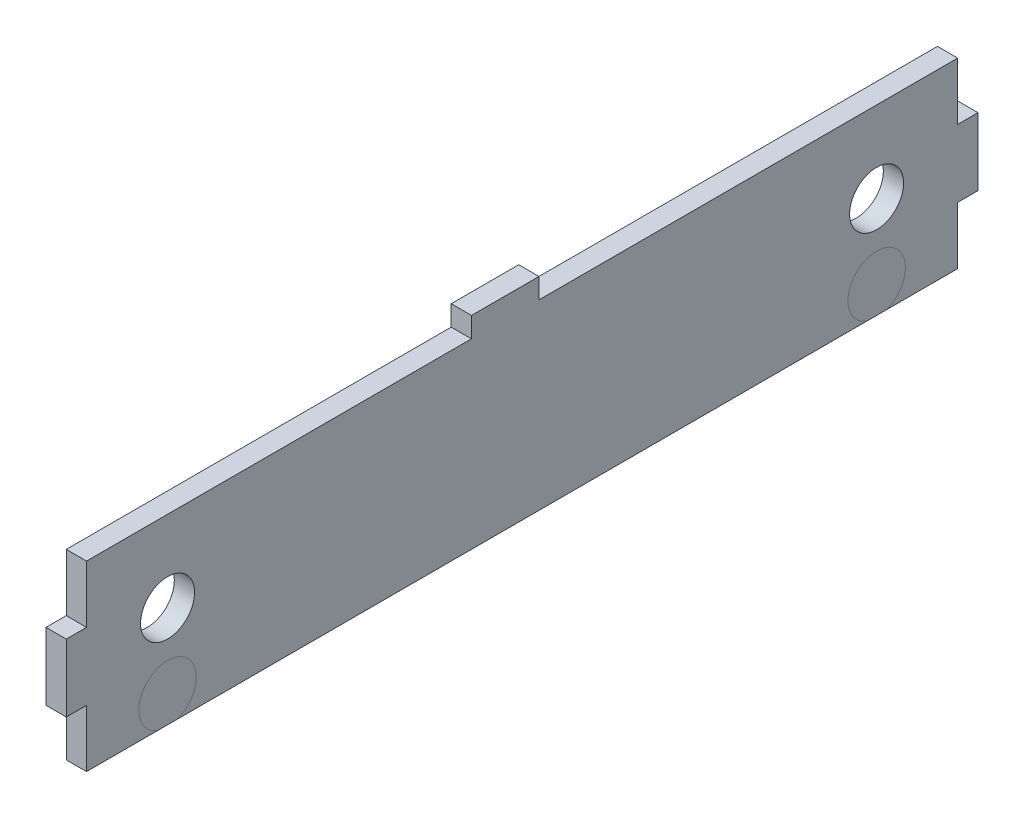
ISO-10303-21;
HEADER;
FILE_DESCRIPTION(('STEP AP214'),'2;1');
FILE_NAME('part.step','',(''),(''),'','','');
FILE_SCHEMA(('AUTOMOTIVE_DESIGN { 1 0 10303 214 1 1 1 1 }'));
ENDSEC;
DATA;
#1=APPLICATION_CONTEXT('core data for automotive mechanical design processes');
#2=APPLICATION_PROTOCOL_DEFINITION('international standard','automotive_design',2000,#1);
#3=PRODUCT_CONTEXT('',#1,'mechanical');
#4=PRODUCT('Part','Part','',(#3));
#5=PRODUCT_RELATED_PRODUCT_CATEGORY('part','',(#4));
#6=PRODUCT_DEFINITION_FORMATION('','',#4);
#7=PRODUCT_DEFINITION_CONTEXT('part definition',#1,'design');
#8=PRODUCT_DEFINITION('design','',#6,#7);
#9=PRODUCT_DEFINITION_SHAPE('','',#8);
#10=(LENGTH_UNIT() NAMED_UNIT(*) SI_UNIT(.MILLI.,.METRE.));
#11=(NAMED_UNIT(*) PLANE_ANGLE_UNIT() SI_UNIT($,.RADIAN.));
#12=(NAMED_UNIT(*) SI_UNIT($,.STERADIAN.) SOLID_ANGLE_UNIT());
#13=UNCERTAINTY_MEASURE_WITH_UNIT(LENGTH_MEASURE(1.E-05),#10,'distance_accuracy_value','');
#14=(GEOMETRIC_REPRESENTATION_CONTEXT(3) GLOBAL_UNCERTAINTY_ASSIGNED_CONTEXT((#13)) GLOBAL_UNIT_ASSIGNED_CONTEXT((#10,
#11,#12)) REPRESENTATION_CONTEXT('',''));
#15=CARTESIAN_POINT('',(0.,0.,0.));
#16=DIRECTION('',(0.,0.,1.));
#17=DIRECTION('',(1.,0.,0.));
#18=AXIS2_PLACEMENT_3D('',#15,#16,#17);
#19=CARTESIAN_POINT('',(-313.51,39.5000001110803,221.989999999999));
#20=CARTESIAN_POINT('',(-313.51,39.5000001110803,225.009999999999));
#21=CARTESIAN_POINT('',(-310.49,39.5000001110803,221.989999999999));
#22=CARTESIAN_POINT('',(-310.49,39.5000001110803,225.009999999999));
#23=(BOUNDED_SURFACE() B_SPLINE_SURFACE(1,1,((#19,#20),(#21,#22)),.UNSPECIFIED.,.F.,.F.,
.F.) B_SPLINE_SURFACE_WITH_KNOTS((2,2),(2,2),(-0.001,0.301),(-0.001,0.301),
.UNSPECIFIED.) GEOMETRIC_REPRESENTATION_ITEM() RATIONAL_B_SPLINE_SURFACE(((1.,1.),(1.,1.))) REPRESENTATION_ITEM('') SURFACE());
#24=CARTESIAN_POINT('',(-310.5,39.5000001110803,221.999999999999));
#25=CARTESIAN_POINT('',(-313.5,39.5000001110803,221.999999999999));
#26=(BOUNDED_CURVE() B_SPLINE_CURVE(1,(#24,#25),.UNSPECIFIED.,.F.,
.F.) B_SPLINE_CURVE_WITH_KNOTS((2,2),(-0.15,0.15),
.UNSPECIFIED.) CURVE() GEOMETRIC_REPRESENTATION_ITEM() RATIONAL_B_SPLINE_CURVE((1.,1.)) REPRESENTATION_ITEM(''));
#27=CARTESIAN_POINT('',(-310.5,39.5000001110803,221.999999999999));
#28=VERTEX_POINT('',#27);
#29=CARTESIAN_POINT('',(-313.5,39.5000001110803,221.999999999999));
#30=VERTEX_POINT('',#29);
#31=EDGE_CURVE('E68',#28,#30,#26,.T.);
#32=CARTESIAN_POINT('',(-310.5,39.5000001110803,221.999999999999));
#33=CARTESIAN_POINT('',(-310.5,39.5000001110803,224.999999999999));
#34=(BOUNDED_CURVE() B_SPLINE_CURVE(1,(#32,#33),.UNSPECIFIED.,.F.,
.F.) B_SPLINE_CURVE_WITH_KNOTS((2,2),(0.,0.3),
.UNSPECIFIED.) CURVE() GEOMETRIC_REPRESENTATION_ITEM() RATIONAL_B_SPLINE_CURVE((1.,1.)) REPRESENTATION_ITEM(''));
#35=CARTESIAN_POINT('',(-310.5,39.5000001110803,224.999999999999));
#36=VERTEX_POINT('',#35);
#37=EDGE_CURVE('E53',#28,#36,#34,.T.);
#38=CARTESIAN_POINT('',(-313.5,39.5000001110803,224.999999999999));
#39=CARTESIAN_POINT('',(-310.5,39.5000001110803,224.999999999999));
#40=(BOUNDED_CURVE() B_SPLINE_CURVE(1,(#38,#39),.UNSPECIFIED.,.F.,
.F.) B_SPLINE_CURVE_WITH_KNOTS((2,2),(-0.3,0.),
.UNSPECIFIED.) CURVE() GEOMETRIC_REPRESENTATION_ITEM() RATIONAL_B_SPLINE_CURVE((1.,1.)) REPRESENTATION_ITEM(''));
#41=CARTESIAN_POINT('',(-313.5,39.5000001110803,224.999999999999));
#42=VERTEX_POINT('',#41);
#43=EDGE_CURVE('E340',#42,#36,#40,.T.);
#44=CARTESIAN_POINT('',(-313.5,39.5000001110803,221.999999999999));
#45=CARTESIAN_POINT('',(-313.5,39.5000001110803,224.999999999999));
#46=(BOUNDED_CURVE() B_SPLINE_CURVE(1,(#44,#45),.UNSPECIFIED.,.F.,
.F.) B_SPLINE_CURVE_WITH_KNOTS((2,2),(0.,0.3),
.UNSPECIFIED.) CURVE() GEOMETRIC_REPRESENTATION_ITEM() RATIONAL_B_SPLINE_CURVE((1.,1.)) REPRESENTATION_ITEM(''));
#47=EDGE_CURVE('E227',#30,#42,#46,.T.);
#48=ORIENTED_EDGE('',*,*,#31,.F.);
#49=ORIENTED_EDGE('',*,*,#37,.T.);
#50=ORIENTED_EDGE('',*,*,#43,.F.);
#51=ORIENTED_EDGE('',*,*,#47,.F.);
#52=EDGE_LOOP('',(#48,#49,#50,#51));
#53=FACE_BOUND('',#52,.T.);
#54=ADVANCED_FACE('F42',(#53),#23,.T.);
#55=CARTESIAN_POINT('',(-310.49,49.5000001110803,221.989999999999));
#56=CARTESIAN_POINT('',(-310.49,49.5000001110803,225.009999999999));
#57=CARTESIAN_POINT('',(-313.51,49.5000001110803,221.989999999999));
#58=CARTESIAN_POINT('',(-313.51,49.5000001110803,225.009999999999));
#59=(BOUNDED_SURFACE() B_SPLINE_SURFACE(1,1,((#55,#56),(#57,#58)),.UNSPECIFIED.,.F.,.F.,
.F.) B_SPLINE_SURFACE_WITH_KNOTS((2,2),(2,2),(-0.001,0.301),(-0.001,0.301),
.UNSPECIFIED.) GEOMETRIC_REPRESENTATION_ITEM() RATIONAL_B_SPLINE_SURFACE(((1.,1.),(1.,1.))) REPRESENTATION_ITEM('') SURFACE());
#60=CARTESIAN_POINT('',(-313.5,49.5000001110803,221.999999999999));
#61=CARTESIAN_POINT('',(-310.5,49.5000001110803,221.999999999999));
#62=(BOUNDED_CURVE() B_SPLINE_CURVE(1,(#60,#61),.UNSPECIFIED.,.F.,
.F.) B_SPLINE_CURVE_WITH_KNOTS((2,2),(-0.3,0.),
.UNSPECIFIED.) CURVE() GEOMETRIC_REPRESENTATION_ITEM() RATIONAL_B_SPLINE_CURVE((1.,1.)) REPRESENTATION_ITEM(''));
#63=CARTESIAN_POINT('',(-313.5,49.5000001110803,221.999999999999));
#64=VERTEX_POINT('',#63);
#65=CARTESIAN_POINT('',(-310.5,49.5000001110803,221.999999999999));
#66=VERTEX_POINT('',#65);
#67=EDGE_CURVE('E341',#64,#66,#62,.T.);
#68=CARTESIAN_POINT('',(-313.5,49.5000001110803,221.999999999999));
#69=CARTESIAN_POINT('',(-313.5,49.5000001110803,224.999999999999));
#70=(BOUNDED_CURVE() B_SPLINE_CURVE(1,(#68,#69),.UNSPECIFIED.,.F.,
.F.) B_SPLINE_CURVE_WITH_KNOTS((2,2),(0.,0.3),
.UNSPECIFIED.) CURVE() GEOMETRIC_REPRESENTATION_ITEM() RATIONAL_B_SPLINE_CURVE((1.,1.)) REPRESENTATION_ITEM(''));
#71=CARTESIAN_POINT('',(-313.5,49.5000001110803,224.999999999999));
#72=VERTEX_POINT('',#71);
#73=EDGE_CURVE('E349',#64,#72,#70,.T.);
#74=CARTESIAN_POINT('',(-310.5,49.5000001110803,224.999999999999));
#75=CARTESIAN_POINT('',(-313.5,49.5000001110803,224.999999999999));
#76=(BOUNDED_CURVE() B_SPLINE_CURVE(1,(#74,#75),.UNSPECIFIED.,.F.,
.F.) B_SPLINE_CURVE_WITH_KNOTS((2,2),(0.,0.3),
.UNSPECIFIED.) CURVE() GEOMETRIC_REPRESENTATION_ITEM() RATIONAL_B_SPLINE_CURVE((1.,1.)) REPRESENTATION_ITEM(''));
#77=CARTESIAN_POINT('',(-310.5,49.5000001110803,224.999999999999));
#78=VERTEX_POINT('',#77);
#79=EDGE_CURVE('E94',#78,#72,#76,.T.);
#80=CARTESIAN_POINT('',(-310.5,49.5000001110803,221.999999999999));
#81=CARTESIAN_POINT('',(-310.5,49.5000001110803,224.999999999999));
#82=(BOUNDED_CURVE() B_SPLINE_CURVE(1,(#80,#81),.UNSPECIFIED.,.F.,
.F.) B_SPLINE_CURVE_WITH_KNOTS((2,2),(0.,0.3),
.UNSPECIFIED.) CURVE() GEOMETRIC_REPRESENTATION_ITEM() RATIONAL_B_SPLINE_CURVE((1.,1.)) REPRESENTATION_ITEM(''));
#83=EDGE_CURVE('E86',#66,#78,#82,.T.);
#84=ORIENTED_EDGE('',*,*,#67,.F.);
#85=ORIENTED_EDGE('',*,*,#73,.T.);
#86=ORIENTED_EDGE('',*,*,#79,.F.);
#87=ORIENTED_EDGE('',*,*,#83,.F.);
#88=EDGE_LOOP('',(#84,#85,#86,#87));
#89=FACE_BOUND('',#88,.T.);
#90=ADVANCED_FACE('F627',(#89),#59,.T.);
#91=CARTESIAN_POINT('',(-313.51,49.5100001110803,224.999999999999));
#92=CARTESIAN_POINT('',(-310.49,49.5100001110803,224.999999999999));
#93=CARTESIAN_POINT('',(-313.51,39.4900001110803,224.999999999999));
#94=CARTESIAN_POINT('',(-310.49,39.4900001110803,224.999999999999));
#95=(BOUNDED_SURFACE() B_SPLINE_SURFACE(1,1,((#91,#92),(#93,#94)),.UNSPECIFIED.,.F.,.F.,
.F.) B_SPLINE_SURFACE_WITH_KNOTS((2,2),(2,2),(-0.501,0.501),(-0.151,0.151),
.UNSPECIFIED.) GEOMETRIC_REPRESENTATION_ITEM() RATIONAL_B_SPLINE_SURFACE(((1.,1.),(1.,1.))) REPRESENTATION_ITEM('') SURFACE());
#96=CARTESIAN_POINT('',(-310.5,39.5000001110803,224.999999999999));
#97=CARTESIAN_POINT('',(-310.5,49.5000001110803,224.999999999999));
#98=(BOUNDED_CURVE() B_SPLINE_CURVE(1,(#96,#97),.UNSPECIFIED.,.F.,
.F.) B_SPLINE_CURVE_WITH_KNOTS((2,2),(0.850000011108212,1.85000001110821),
.UNSPECIFIED.) CURVE() GEOMETRIC_REPRESENTATION_ITEM() RATIONAL_B_SPLINE_CURVE((1.,1.)) REPRESENTATION_ITEM(''));
#99=EDGE_CURVE('E483',#36,#78,#98,.T.);
#100=CARTESIAN_POINT('',(-313.5,49.5000001110803,224.999999999999));
#101=CARTESIAN_POINT('',(-313.5,39.5000001110803,224.999999999999));
#102=(BOUNDED_CURVE() B_SPLINE_CURVE(1,(#100,#101),.UNSPECIFIED.,.F.,
.F.) B_SPLINE_CURVE_WITH_KNOTS((2,2),(0.850000011108212,1.85000001110821),
.UNSPECIFIED.) CURVE() GEOMETRIC_REPRESENTATION_ITEM() RATIONAL_B_SPLINE_CURVE((1.,1.)) REPRESENTATION_ITEM(''));
#103=EDGE_CURVE('E350',#72,#42,#102,.T.);
#104=ORIENTED_EDGE('',*,*,#99,.T.);
#105=ORIENTED_EDGE('',*,*,#79,.T.);
#106=ORIENTED_EDGE('',*,*,#103,.T.);
#107=ORIENTED_EDGE('',*,*,#43,.T.);
#108=EDGE_LOOP('',(#104,#105,#106,#107));
#109=FACE_BOUND('',#108,.T.);
#110=ADVANCED_FACE('F601',(#109),#95,.T.);
#111=CARTESIAN_POINT('',(-310.49,19.9899961853027,221.999999999999));
#112=CARTESIAN_POINT('',(-313.51,19.9899961853027,221.999999999999));
#113=CARTESIAN_POINT('',(-310.49,39.5100001110803,221.999999999999));
#114=CARTESIAN_POINT('',(-313.51,39.5100001110803,221.999999999999));
#115=(BOUNDED_SURFACE() B_SPLINE_SURFACE(1,1,((#111,#112),(#113,#114)),.UNSPECIFIED.,.F.,.F.,
.F.) B_SPLINE_SURFACE_WITH_KNOTS((2,2),(2,2),(-1.10100038146954,0.851000011108213),(-0.001,
0.301),.UNSPECIFIED.) GEOMETRIC_REPRESENTATION_ITEM() RATIONAL_B_SPLINE_SURFACE(((1.,1.),(1.,1.))) REPRESENTATION_ITEM('') SURFACE());
#116=DIRECTION('',(-1.,0.,0.));
#117=VECTOR('',#116,1.);
#118=CARTESIAN_POINT('',(-312.,30.9999961853027,221.999999999999));
#119=LINE('',#118,#117);
#120=CARTESIAN_POINT('',(-310.5,30.9999961853027,221.999999999999));
#121=VERTEX_POINT('',#120);
#122=CARTESIAN_POINT('',(-313.5,30.9999961853027,221.999999999999));
#123=VERTEX_POINT('',#122);
#124=EDGE_CURVE('E199',#121,#123,#119,.T.);
#125=CARTESIAN_POINT('',(-310.5,39.5000001110803,221.999999999999));
#126=CARTESIAN_POINT('',(-310.5,19.9999961853027,221.999999999999));
#127=(BOUNDED_CURVE() B_SPLINE_CURVE(1,(#125,#126),.UNSPECIFIED.,.F.,
.F.) B_SPLINE_CURVE_WITH_KNOTS((2,2),(4.39999998889179,6.35000038146954),
.UNSPECIFIED.) CURVE() GEOMETRIC_REPRESENTATION_ITEM() RATIONAL_B_SPLINE_CURVE((1.,1.)) REPRESENTATION_ITEM(''));
#128=EDGE_CURVE('E404',#28,#121,#127,.T.);
#129=CARTESIAN_POINT('',(-313.5,19.9999961853027,221.999999999999));
#130=CARTESIAN_POINT('',(-313.5,39.5000001110803,221.999999999999));
#131=(BOUNDED_CURVE() B_SPLINE_CURVE(1,(#129,#130),.UNSPECIFIED.,.F.,
.F.) B_SPLINE_CURVE_WITH_KNOTS((2,2),(-6.35000038146954,-4.39999998889179),
.UNSPECIFIED.) CURVE() GEOMETRIC_REPRESENTATION_ITEM() RATIONAL_B_SPLINE_CURVE((1.,1.)) REPRESENTATION_ITEM(''));
#132=EDGE_CURVE('E216',#123,#30,#131,.T.);
#133=ORIENTED_EDGE('',*,*,#124,.F.);
#134=ORIENTED_EDGE('',*,*,#128,.F.);
#135=ORIENTED_EDGE('',*,*,#31,.T.);
#136=ORIENTED_EDGE('',*,*,#132,.F.);
#137=EDGE_LOOP('',(#133,#134,#135,#136));
#138=FACE_BOUND('',#137,.T.);
#139=ADVANCED_FACE('F224',(#138),#115,.T.);
#140=CARTESIAN_POINT('',(-310.49,49.4900001110803,221.999999999999));
#141=CARTESIAN_POINT('',(-313.51,49.4900001110803,221.999999999999));
#142=CARTESIAN_POINT('',(-310.49,58.0100002221624,221.999999999999));
#143=CARTESIAN_POINT('',(-313.51,58.0100002221624,221.999999999999));
#144=(BOUNDED_SURFACE() B_SPLINE_SURFACE(1,1,((#140,#141),(#142,#143)),.UNSPECIFIED.,.F.,.F.,
.F.) B_SPLINE_SURFACE_WITH_KNOTS((2,2),(2,2),(1.84900001110821,2.70100002221642),(-0.001,0.301),
.UNSPECIFIED.) GEOMETRIC_REPRESENTATION_ITEM() RATIONAL_B_SPLINE_SURFACE(((1.,1.),(1.,1.))) REPRESENTATION_ITEM('') SURFACE());
#145=CARTESIAN_POINT('',(-310.5,58.0000002221624,221.999999999999));
#146=CARTESIAN_POINT('',(-310.5,49.5000001110803,221.999999999999));
#147=(BOUNDED_CURVE() B_SPLINE_CURVE(1,(#145,#146),.UNSPECIFIED.,.F.,
.F.) B_SPLINE_CURVE_WITH_KNOTS((2,2),(2.54999997778358,3.39999998889179),
.UNSPECIFIED.) CURVE() GEOMETRIC_REPRESENTATION_ITEM() RATIONAL_B_SPLINE_CURVE((1.,1.)) REPRESENTATION_ITEM(''));
#148=CARTESIAN_POINT('',(-310.5,58.0000002221624,221.999999999999));
#149=VERTEX_POINT('',#148);
#150=EDGE_CURVE('E460',#149,#66,#147,.T.);
#151=CARTESIAN_POINT('',(-310.5,58.0000002221624,221.999999999999));
#152=CARTESIAN_POINT('',(-313.5,58.0000002221624,221.999999999999));
#153=(BOUNDED_CURVE() B_SPLINE_CURVE(1,(#151,#152),.UNSPECIFIED.,.F.,
.F.) B_SPLINE_CURVE_WITH_KNOTS((2,2),(0.,0.3),
.UNSPECIFIED.) CURVE() GEOMETRIC_REPRESENTATION_ITEM() RATIONAL_B_SPLINE_CURVE((1.,1.)) REPRESENTATION_ITEM(''));
#154=CARTESIAN_POINT('',(-313.5,58.0000002221624,221.999999999999));
#155=VERTEX_POINT('',#154);
#156=EDGE_CURVE('E277',#149,#155,#153,.T.);
#157=CARTESIAN_POINT('',(-313.5,49.5000001110803,221.999999999999));
#158=CARTESIAN_POINT('',(-313.5,58.0000002221624,221.999999999999));
#159=(BOUNDED_CURVE() B_SPLINE_CURVE(1,(#157,#158),.UNSPECIFIED.,.F.,
.F.) B_SPLINE_CURVE_WITH_KNOTS((2,2),(-3.39999998889179,-2.54999997778358),
.UNSPECIFIED.) CURVE() GEOMETRIC_REPRESENTATION_ITEM() RATIONAL_B_SPLINE_CURVE((1.,1.)) REPRESENTATION_ITEM(''));
#160=EDGE_CURVE('E237',#64,#155,#159,.T.);
#161=ORIENTED_EDGE('',*,*,#67,.T.);
#162=ORIENTED_EDGE('',*,*,#150,.F.);
#163=ORIENTED_EDGE('',*,*,#156,.T.);
#164=ORIENTED_EDGE('',*,*,#160,.F.);
#165=EDGE_LOOP('',(#161,#162,#163,#164));
#166=FACE_BOUND('',#165,.T.);
#167=ADVANCED_FACE('F873',(#166),#144,.T.);
#168=CARTESIAN_POINT('',(-313.51,49.5000001110803,93.009999999999));
#169=CARTESIAN_POINT('',(-313.51,49.5000001110803,89.989999999999));
#170=CARTESIAN_POINT('',(-310.49,49.5000001110803,93.009999999999));
#171=CARTESIAN_POINT('',(-310.49,49.5000001110803,89.989999999999));
#172=(BOUNDED_SURFACE() B_SPLINE_SURFACE(1,1,((#168,#169),(#170,#171)),.UNSPECIFIED.,.F.,.F.,
.F.) B_SPLINE_SURFACE_WITH_KNOTS((2,2),(2,2),(-0.001,0.301000000000004),(0.499,0.801),
.UNSPECIFIED.) GEOMETRIC_REPRESENTATION_ITEM() RATIONAL_B_SPLINE_SURFACE(((1.,1.),(1.,1.))) REPRESENTATION_ITEM('') SURFACE());
#173=CARTESIAN_POINT('',(-310.5,49.5000001110803,92.999999999999));
#174=CARTESIAN_POINT('',(-313.5,49.5000001110803,92.999999999999));
#175=(BOUNDED_CURVE() B_SPLINE_CURVE(1,(#173,#174),.UNSPECIFIED.,.F.,
.F.) B_SPLINE_CURVE_WITH_KNOTS((2,2),(-0.15,0.15),
.UNSPECIFIED.) CURVE() GEOMETRIC_REPRESENTATION_ITEM() RATIONAL_B_SPLINE_CURVE((1.,1.)) REPRESENTATION_ITEM(''));
#176=CARTESIAN_POINT('',(-310.5,49.5000001110803,92.999999999999));
#177=VERTEX_POINT('',#176);
#178=CARTESIAN_POINT('',(-313.5,49.5000001110803,92.999999999999));
#179=VERTEX_POINT('',#178);
#180=EDGE_CURVE('E500',#177,#179,#175,.T.);
#181=CARTESIAN_POINT('',(-310.5,49.5000001110803,92.999999999999));
#182=CARTESIAN_POINT('',(-310.5,49.5000001110803,89.999999999999));
#183=(BOUNDED_CURVE() B_SPLINE_CURVE(1,(#181,#182),.UNSPECIFIED.,.F.,
.F.) B_SPLINE_CURVE_WITH_KNOTS((2,2),(0.5,0.8),
.UNSPECIFIED.) CURVE() GEOMETRIC_REPRESENTATION_ITEM() RATIONAL_B_SPLINE_CURVE((1.,1.)) REPRESENTATION_ITEM(''));
#184=CARTESIAN_POINT('',(-310.5,49.5000001110803,89.999999999999));
#185=VERTEX_POINT('',#184);
#186=EDGE_CURVE('E268',#177,#185,#183,.T.);
#187=CARTESIAN_POINT('',(-313.5,49.5000001110803,89.999999999999));
#188=CARTESIAN_POINT('',(-310.5,49.5000001110803,89.999999999999));
#189=(BOUNDED_CURVE() B_SPLINE_CURVE(1,(#187,#188),.UNSPECIFIED.,.F.,
.F.) B_SPLINE_CURVE_WITH_KNOTS((2,2),(0.,0.3),
.UNSPECIFIED.) CURVE() GEOMETRIC_REPRESENTATION_ITEM() RATIONAL_B_SPLINE_CURVE((1.,1.)) REPRESENTATION_ITEM(''));
#190=CARTESIAN_POINT('',(-313.5,49.5000001110803,89.999999999999));
#191=VERTEX_POINT('',#190);
#192=EDGE_CURVE('E435',#191,#185,#189,.T.);
#193=CARTESIAN_POINT('',(-313.5,49.5000001110803,92.999999999999));
#194=CARTESIAN_POINT('',(-313.5,49.5000001110803,89.999999999999));
#195=(BOUNDED_CURVE() B_SPLINE_CURVE(1,(#193,#194),.UNSPECIFIED.,.F.,
.F.) B_SPLINE_CURVE_WITH_KNOTS((2,2),(0.5,0.8),
.UNSPECIFIED.) CURVE() GEOMETRIC_REPRESENTATION_ITEM() RATIONAL_B_SPLINE_CURVE((1.,1.)) REPRESENTATION_ITEM(''));
#196=EDGE_CURVE('E234',#179,#191,#195,.T.);
#197=ORIENTED_EDGE('',*,*,#180,.F.);
#198=ORIENTED_EDGE('',*,*,#186,.T.);
#199=ORIENTED_EDGE('',*,*,#192,.F.);
#200=ORIENTED_EDGE('',*,*,#196,.F.);
#201=EDGE_LOOP('',(#197,#198,#199,#200));
#202=FACE_BOUND('',#201,.T.);
#203=ADVANCED_FACE('F44',(#202),#172,.T.);
#204=CARTESIAN_POINT('',(-310.49,39.5000001110803,93.009999999999));
#205=CARTESIAN_POINT('',(-310.49,39.5000001110803,89.989999999999));
#206=CARTESIAN_POINT('',(-313.51,39.5000001110803,93.009999999999));
#207=CARTESIAN_POINT('',(-313.51,39.5000001110803,89.989999999999));
#208=(BOUNDED_SURFACE() B_SPLINE_SURFACE(1,1,((#204,#205),(#206,#207)),.UNSPECIFIED.,.F.,.F.,
.F.) B_SPLINE_SURFACE_WITH_KNOTS((2,2),(2,2),(-0.00100000000000178,0.301),(-0.001,0.301),
.UNSPECIFIED.) GEOMETRIC_REPRESENTATION_ITEM() RATIONAL_B_SPLINE_SURFACE(((1.,1.),(1.,1.))) REPRESENTATION_ITEM('') SURFACE());
#209=CARTESIAN_POINT('',(-313.5,39.5000001110803,92.999999999999));
#210=CARTESIAN_POINT('',(-310.5,39.5000001110803,92.999999999999));
#211=(BOUNDED_CURVE() B_SPLINE_CURVE(1,(#209,#210),.UNSPECIFIED.,.F.,
.F.) B_SPLINE_CURVE_WITH_KNOTS((2,2),(-0.3,0.),
.UNSPECIFIED.) CURVE() GEOMETRIC_REPRESENTATION_ITEM() RATIONAL_B_SPLINE_CURVE((1.,1.)) REPRESENTATION_ITEM(''));
#212=CARTESIAN_POINT('',(-313.5,39.5000001110803,92.999999999999));
#213=VERTEX_POINT('',#212);
#214=CARTESIAN_POINT('',(-310.5,39.5000001110803,92.999999999999));
#215=VERTEX_POINT('',#214);
#216=EDGE_CURVE('E491',#213,#215,#211,.T.);
#217=CARTESIAN_POINT('',(-313.5,39.5000001110803,92.999999999999));
#218=CARTESIAN_POINT('',(-313.5,39.5000001110803,89.999999999999));
#219=(BOUNDED_CURVE() B_SPLINE_CURVE(1,(#217,#218),.UNSPECIFIED.,.F.,
.F.) B_SPLINE_CURVE_WITH_KNOTS((2,2),(0.,0.3),
.UNSPECIFIED.) CURVE() GEOMETRIC_REPRESENTATION_ITEM() RATIONAL_B_SPLINE_CURVE((1.,1.)) REPRESENTATION_ITEM(''));
#220=CARTESIAN_POINT('',(-313.5,39.5000001110803,89.999999999999));
#221=VERTEX_POINT('',#220);
#222=EDGE_CURVE('E278',#213,#221,#219,.T.);
#223=CARTESIAN_POINT('',(-310.5,39.5000001110803,89.999999999999));
#224=CARTESIAN_POINT('',(-313.5,39.5000001110803,89.999999999999));
#225=(BOUNDED_CURVE() B_SPLINE_CURVE(1,(#223,#224),.UNSPECIFIED.,.F.,
.F.) B_SPLINE_CURVE_WITH_KNOTS((2,2),(-0.3,0.),
.UNSPECIFIED.) CURVE() GEOMETRIC_REPRESENTATION_ITEM() RATIONAL_B_SPLINE_CURVE((1.,1.)) REPRESENTATION_ITEM(''));
#226=CARTESIAN_POINT('',(-310.5,39.5000001110803,89.999999999999));
#227=VERTEX_POINT('',#226);
#228=EDGE_CURVE('E289',#227,#221,#225,.T.);
#229=CARTESIAN_POINT('',(-310.5,39.5000001110803,92.999999999999));
#230=CARTESIAN_POINT('',(-310.5,39.5000001110803,89.999999999999));
#231=(BOUNDED_CURVE() B_SPLINE_CURVE(1,(#229,#230),.UNSPECIFIED.,.F.,
.F.) B_SPLINE_CURVE_WITH_KNOTS((2,2),(0.,0.3),
.UNSPECIFIED.) CURVE() GEOMETRIC_REPRESENTATION_ITEM() RATIONAL_B_SPLINE_CURVE((1.,1.)) REPRESENTATION_ITEM(''));
#232=EDGE_CURVE('E243',#215,#227,#231,.T.);
#233=ORIENTED_EDGE('',*,*,#216,.F.);
#234=ORIENTED_EDGE('',*,*,#222,.T.);
#235=ORIENTED_EDGE('',*,*,#228,.F.);
#236=ORIENTED_EDGE('',*,*,#232,.F.);
#237=EDGE_LOOP('',(#233,#234,#235,#236));
#238=FACE_BOUND('',#237,.T.);
#239=ADVANCED_FACE('F814',(#238),#208,.T.);
#240=CARTESIAN_POINT('',(-313.51,39.4900001110803,89.999999999999));
#241=CARTESIAN_POINT('',(-310.49,39.4900001110803,89.999999999999));
#242=CARTESIAN_POINT('',(-313.51,49.5100001110803,89.999999999999));
#243=CARTESIAN_POINT('',(-310.49,49.5100001110803,89.999999999999));
#244=(BOUNDED_SURFACE() B_SPLINE_SURFACE(1,1,((#240,#241),(#242,#243)),.UNSPECIFIED.,.F.,.F.,
.F.) B_SPLINE_SURFACE_WITH_KNOTS((2,2),(2,2),(-0.501,0.501),(-0.151,0.151),
.UNSPECIFIED.) GEOMETRIC_REPRESENTATION_ITEM() RATIONAL_B_SPLINE_SURFACE(((1.,1.),(1.,1.))) REPRESENTATION_ITEM('') SURFACE());
#245=CARTESIAN_POINT('',(-313.5,39.5000001110803,89.999999999999));
#246=CARTESIAN_POINT('',(-313.5,49.5000001110803,89.999999999999));
#247=(BOUNDED_CURVE() B_SPLINE_CURVE(1,(#245,#246),.UNSPECIFIED.,.F.,
.F.) B_SPLINE_CURVE_WITH_KNOTS((2,2),(0.850000011108214,1.85000001110821),
.UNSPECIFIED.) CURVE() GEOMETRIC_REPRESENTATION_ITEM() RATIONAL_B_SPLINE_CURVE((1.,1.)) REPRESENTATION_ITEM(''));
#248=EDGE_CURVE('E296',#221,#191,#247,.T.);
#249=CARTESIAN_POINT('',(-310.5,49.5000001110803,89.999999999999));
#250=CARTESIAN_POINT('',(-310.5,39.5000001110803,89.999999999999));
#251=(BOUNDED_CURVE() B_SPLINE_CURVE(1,(#249,#250),.UNSPECIFIED.,.F.,
.F.) B_SPLINE_CURVE_WITH_KNOTS((2,2),(0.85000001110821,1.85000001110821),
.UNSPECIFIED.) CURVE() GEOMETRIC_REPRESENTATION_ITEM() RATIONAL_B_SPLINE_CURVE((1.,1.)) REPRESENTATION_ITEM(''));
#252=EDGE_CURVE('E442',#185,#227,#251,.T.);
#253=ORIENTED_EDGE('',*,*,#228,.T.);
#254=ORIENTED_EDGE('',*,*,#248,.T.);
#255=ORIENTED_EDGE('',*,*,#192,.T.);
#256=ORIENTED_EDGE('',*,*,#252,.T.);
#257=EDGE_LOOP('',(#253,#254,#255,#256));
#258=FACE_BOUND('',#257,.T.);
#259=ADVANCED_FACE('F809',(#258),#244,.T.);
#260=CARTESIAN_POINT('',(-310.49,58.0100002221624,92.999999999999));
#261=CARTESIAN_POINT('',(-313.51,58.0100002221624,92.999999999999));
#262=CARTESIAN_POINT('',(-310.49,49.4900001110803,92.999999999999));
#263=CARTESIAN_POINT('',(-313.51,49.4900001110803,92.999999999999));
#264=(BOUNDED_SURFACE() B_SPLINE_SURFACE(1,1,((#260,#261),(#262,#263)),.UNSPECIFIED.,.F.,.F.,
.F.) B_SPLINE_SURFACE_WITH_KNOTS((2,2),(2,2),(-0.0152817318439183,0.836718279264296),
(-0.00100000000000178,0.301),
.UNSPECIFIED.) GEOMETRIC_REPRESENTATION_ITEM() RATIONAL_B_SPLINE_SURFACE(((1.,1.),(1.,1.))) REPRESENTATION_ITEM('') SURFACE());
#265=CARTESIAN_POINT('',(-313.5,58.0000002221624,92.999999999999));
#266=CARTESIAN_POINT('',(-313.5,49.5000001110803,92.999999999999));
#267=(BOUNDED_CURVE() B_SPLINE_CURVE(1,(#265,#266),.UNSPECIFIED.,.F.,
.F.) B_SPLINE_CURVE_WITH_KNOTS((2,2),(3.89285912296983,4.74285913407804),
.UNSPECIFIED.) CURVE() GEOMETRIC_REPRESENTATION_ITEM() RATIONAL_B_SPLINE_CURVE((1.,1.)) REPRESENTATION_ITEM(''));
#268=CARTESIAN_POINT('',(-313.5,58.0000002221624,92.999999999999));
#269=VERTEX_POINT('',#268);
#270=EDGE_CURVE('E258',#269,#179,#267,.T.);
#271=CARTESIAN_POINT('',(-310.5,58.0000002221624,92.999999999999));
#272=CARTESIAN_POINT('',(-313.5,58.0000002221624,92.999999999999));
#273=(BOUNDED_CURVE() B_SPLINE_CURVE(1,(#271,#272),.UNSPECIFIED.,.F.,
.F.) B_SPLINE_CURVE_WITH_KNOTS((2,2),(0.,0.3),
.UNSPECIFIED.) CURVE() GEOMETRIC_REPRESENTATION_ITEM() RATIONAL_B_SPLINE_CURVE((1.,1.)) REPRESENTATION_ITEM(''));
#274=CARTESIAN_POINT('',(-310.5,58.0000002221624,92.999999999999));
#275=VERTEX_POINT('',#274);
#276=EDGE_CURVE('E297',#275,#269,#273,.T.);
#277=CARTESIAN_POINT('',(-310.5,49.5000001110803,92.999999999999));
#278=CARTESIAN_POINT('',(-310.5,58.0000002221624,92.999999999999));
#279=(BOUNDED_CURVE() B_SPLINE_CURVE(1,(#277,#278),.UNSPECIFIED.,.F.,
.F.) B_SPLINE_CURVE_WITH_KNOTS((2,2),(-4.74285913407804,-3.89285912296983),
.UNSPECIFIED.) CURVE() GEOMETRIC_REPRESENTATION_ITEM() RATIONAL_B_SPLINE_CURVE((1.,1.)) REPRESENTATION_ITEM(''));
#280=EDGE_CURVE('E561',#177,#275,#279,.T.);
#281=ORIENTED_EDGE('',*,*,#180,.T.);
#282=ORIENTED_EDGE('',*,*,#270,.F.);
#283=ORIENTED_EDGE('',*,*,#276,.F.);
#284=ORIENTED_EDGE('',*,*,#280,.F.);
#285=EDGE_LOOP('',(#281,#282,#283,#284));
#286=FACE_BOUND('',#285,.T.);
#287=ADVANCED_FACE('F813',(#286),#264,.T.);
#288=CARTESIAN_POINT('',(-310.49,39.5100001110803,92.999999999999));
#289=CARTESIAN_POINT('',(-313.51,39.5100001110803,92.999999999999));
#290=CARTESIAN_POINT('',(-310.49,19.9899961853027,92.999999999999));
#291=CARTESIAN_POINT('',(-313.51,19.9899961853027,92.999999999999));
#292=(BOUNDED_SURFACE() B_SPLINE_SURFACE(1,1,((#288,#289),(#290,#291)),.UNSPECIFIED.,.F.,.F.,
.F.) B_SPLINE_SURFACE_WITH_KNOTS((2,2),(2,2),(1.8347182792643,3.78671867184205),
(-0.00100000000000178,0.301),
.UNSPECIFIED.) GEOMETRIC_REPRESENTATION_ITEM() RATIONAL_B_SPLINE_SURFACE(((1.,1.),(1.,1.))) REPRESENTATION_ITEM('') SURFACE());
#293=DIRECTION('',(1.,0.,0.));
#294=VECTOR('',#293,1.);
#295=CARTESIAN_POINT('',(-312.,30.9999961853027,92.999999999999));
#296=LINE('',#295,#294);
#297=CARTESIAN_POINT('',(-313.5,30.9999961853027,92.999999999999));
#298=VERTEX_POINT('',#297);
#299=CARTESIAN_POINT('',(-310.5,30.9999961853027,92.999999999999));
#300=VERTEX_POINT('',#299);
#301=EDGE_CURVE('E212',#298,#300,#296,.T.);
#302=CARTESIAN_POINT('',(-313.5,39.5000001110803,92.999999999999));
#303=CARTESIAN_POINT('',(-313.5,19.9999961853027,92.999999999999));
#304=(BOUNDED_CURVE() B_SPLINE_CURVE(1,(#302,#303),.UNSPECIFIED.,.F.,
.F.) B_SPLINE_CURVE_WITH_KNOTS((2,2),(5.74285913407804,7.6928595266558),
.UNSPECIFIED.) CURVE() GEOMETRIC_REPRESENTATION_ITEM() RATIONAL_B_SPLINE_CURVE((1.,1.)) REPRESENTATION_ITEM(''));
#305=EDGE_CURVE('E226',#213,#298,#304,.T.);
#306=CARTESIAN_POINT('',(-310.5,19.9999961853027,92.999999999999));
#307=CARTESIAN_POINT('',(-310.5,39.5000001110803,92.999999999999));
#308=(BOUNDED_CURVE() B_SPLINE_CURVE(1,(#306,#307),.UNSPECIFIED.,.F.,
.F.) B_SPLINE_CURVE_WITH_KNOTS((2,2),(-7.6928595266558,-5.74285913407804),
.UNSPECIFIED.) CURVE() GEOMETRIC_REPRESENTATION_ITEM() RATIONAL_B_SPLINE_CURVE((1.,1.)) REPRESENTATION_ITEM(''));
#309=EDGE_CURVE('E396',#300,#215,#308,.T.);
#310=ORIENTED_EDGE('',*,*,#301,.F.);
#311=ORIENTED_EDGE('',*,*,#305,.F.);
#312=ORIENTED_EDGE('',*,*,#216,.T.);
#313=ORIENTED_EDGE('',*,*,#309,.F.);
#314=EDGE_LOOP('',(#310,#311,#312,#313));
#315=FACE_BOUND('',#314,.T.);
#316=ADVANCED_FACE('F840',(#315),#292,.T.);
#317=CARTESIAN_POINT('',(-313.51,57.9900002221624,164.999999999999));
#318=CARTESIAN_POINT('',(-313.51,61.0100002221624,164.999999999999));
#319=CARTESIAN_POINT('',(-310.49,57.9900002221624,164.999999999999));
#320=CARTESIAN_POINT('',(-310.49,61.0100002221624,164.999999999999));
#321=(BOUNDED_SURFACE() B_SPLINE_SURFACE(1,1,((#317,#318),(#319,#320)),.UNSPECIFIED.,.F.,.F.,
.F.) B_SPLINE_SURFACE_WITH_KNOTS((2,2),(2,2),(-0.001,0.301),(-0.00100000000000006,0.301),
.UNSPECIFIED.) GEOMETRIC_REPRESENTATION_ITEM() RATIONAL_B_SPLINE_SURFACE(((1.,1.),(1.,1.))) REPRESENTATION_ITEM('') SURFACE());
#322=CARTESIAN_POINT('',(-310.5,58.0000002221624,164.999999999999));
#323=CARTESIAN_POINT('',(-313.5,58.0000002221624,164.999999999999));
#324=(BOUNDED_CURVE() B_SPLINE_CURVE(1,(#322,#323),.UNSPECIFIED.,.F.,
.F.) B_SPLINE_CURVE_WITH_KNOTS((2,2),(-0.15,0.15),
.UNSPECIFIED.) CURVE() GEOMETRIC_REPRESENTATION_ITEM() RATIONAL_B_SPLINE_CURVE((1.,1.)) REPRESENTATION_ITEM(''));
#325=CARTESIAN_POINT('',(-310.5,58.0000002221624,164.999999999999));
#326=VERTEX_POINT('',#325);
#327=CARTESIAN_POINT('',(-313.5,58.0000002221624,164.999999999999));
#328=VERTEX_POINT('',#327);
#329=EDGE_CURVE('E324',#326,#328,#324,.T.);
#330=CARTESIAN_POINT('',(-310.5,58.0000002221624,164.999999999999));
#331=CARTESIAN_POINT('',(-310.5,61.0000002221624,164.999999999999));
#332=(BOUNDED_CURVE() B_SPLINE_CURVE(1,(#330,#331),.UNSPECIFIED.,.F.,
.F.) B_SPLINE_CURVE_WITH_KNOTS((2,2),(0.,0.3),
.UNSPECIFIED.) CURVE() GEOMETRIC_REPRESENTATION_ITEM() RATIONAL_B_SPLINE_CURVE((1.,1.)) REPRESENTATION_ITEM(''));
#333=CARTESIAN_POINT('',(-310.5,61.0000002221624,164.999999999999));
#334=VERTEX_POINT('',#333);
#335=EDGE_CURVE('E256',#326,#334,#332,.T.);
#336=CARTESIAN_POINT('',(-313.5,61.0000002221624,164.999999999999));
#337=CARTESIAN_POINT('',(-310.5,61.0000002221624,164.999999999999));
#338=(BOUNDED_CURVE() B_SPLINE_CURVE(1,(#336,#337),.UNSPECIFIED.,.F.,
.F.) B_SPLINE_CURVE_WITH_KNOTS((2,2),(-0.3,0.),
.UNSPECIFIED.) CURVE() GEOMETRIC_REPRESENTATION_ITEM() RATIONAL_B_SPLINE_CURVE((1.,1.)) REPRESENTATION_ITEM(''));
#339=CARTESIAN_POINT('',(-313.5,61.0000002221624,164.999999999999));
#340=VERTEX_POINT('',#339);
#341=EDGE_CURVE('E110',#340,#334,#338,.T.);
#342=CARTESIAN_POINT('',(-313.5,58.0000002221624,164.999999999999));
#343=CARTESIAN_POINT('',(-313.5,61.0000002221624,164.999999999999));
#344=(BOUNDED_CURVE() B_SPLINE_CURVE(1,(#342,#343),.UNSPECIFIED.,.F.,
.F.) B_SPLINE_CURVE_WITH_KNOTS((2,2),(0.,0.3),
.UNSPECIFIED.) CURVE() GEOMETRIC_REPRESENTATION_ITEM() RATIONAL_B_SPLINE_CURVE((1.,1.)) REPRESENTATION_ITEM(''));
#345=EDGE_CURVE('E121',#328,#340,#344,.T.);
#346=ORIENTED_EDGE('',*,*,#329,.F.);
#347=ORIENTED_EDGE('',*,*,#335,.T.);
#348=ORIENTED_EDGE('',*,*,#341,.F.);
#349=ORIENTED_EDGE('',*,*,#345,.F.);
#350=EDGE_LOOP('',(#346,#347,#348,#349));
#351=FACE_BOUND('',#350,.T.);
#352=ADVANCED_FACE('F853',(#351),#321,.T.);
#353=CARTESIAN_POINT('',(-310.49,57.9900002221624,154.999999999999));
#354=CARTESIAN_POINT('',(-310.49,61.0100002221624,154.999999999999));
#355=CARTESIAN_POINT('',(-313.51,57.9900002221624,154.999999999999));
#356=CARTESIAN_POINT('',(-313.51,61.0100002221624,154.999999999999));
#357=(BOUNDED_SURFACE() B_SPLINE_SURFACE(1,1,((#353,#354),(#355,#356)),.UNSPECIFIED.,.F.,.F.,
.F.) B_SPLINE_SURFACE_WITH_KNOTS((2,2),(2,2),(-0.001,0.301),(-0.00100000000000006,0.301),
.UNSPECIFIED.) GEOMETRIC_REPRESENTATION_ITEM() RATIONAL_B_SPLINE_SURFACE(((1.,1.),(1.,1.))) REPRESENTATION_ITEM('') SURFACE());
#358=CARTESIAN_POINT('',(-313.5,58.0000002221624,154.999999999999));
#359=CARTESIAN_POINT('',(-310.5,58.0000002221624,154.999999999999));
#360=(BOUNDED_CURVE() B_SPLINE_CURVE(1,(#358,#359),.UNSPECIFIED.,.F.,
.F.) B_SPLINE_CURVE_WITH_KNOTS((2,2),(-0.3,0.),
.UNSPECIFIED.) CURVE() GEOMETRIC_REPRESENTATION_ITEM() RATIONAL_B_SPLINE_CURVE((1.,1.)) REPRESENTATION_ITEM(''));
#361=CARTESIAN_POINT('',(-313.5,58.0000002221624,154.999999999999));
#362=VERTEX_POINT('',#361);
#363=CARTESIAN_POINT('',(-310.5,58.0000002221624,154.999999999999));
#364=VERTEX_POINT('',#363);
#365=EDGE_CURVE('E306',#362,#364,#360,.T.);
#366=CARTESIAN_POINT('',(-313.5,58.0000002221624,154.999999999999));
#367=CARTESIAN_POINT('',(-313.5,61.0000002221624,154.999999999999));
#368=(BOUNDED_CURVE() B_SPLINE_CURVE(1,(#366,#367),.UNSPECIFIED.,.F.,
.F.) B_SPLINE_CURVE_WITH_KNOTS((2,2),(0.,0.3),
.UNSPECIFIED.) CURVE() GEOMETRIC_REPRESENTATION_ITEM() RATIONAL_B_SPLINE_CURVE((1.,1.)) REPRESENTATION_ITEM(''));
#369=CARTESIAN_POINT('',(-313.5,61.0000002221624,154.999999999999));
#370=VERTEX_POINT('',#369);
#371=EDGE_CURVE('E247',#362,#370,#368,.T.);
#372=CARTESIAN_POINT('',(-310.5,61.0000002221624,154.999999999999));
#373=CARTESIAN_POINT('',(-313.5,61.0000002221624,154.999999999999));
#374=(BOUNDED_CURVE() B_SPLINE_CURVE(1,(#372,#373),.UNSPECIFIED.,.F.,
.F.) B_SPLINE_CURVE_WITH_KNOTS((2,2),(0.,0.3),
.UNSPECIFIED.) CURVE() GEOMETRIC_REPRESENTATION_ITEM() RATIONAL_B_SPLINE_CURVE((1.,1.)) REPRESENTATION_ITEM(''));
#375=CARTESIAN_POINT('',(-310.5,61.0000002221624,154.999999999999));
#376=VERTEX_POINT('',#375);
#377=EDGE_CURVE('E315',#376,#370,#374,.T.);
#378=CARTESIAN_POINT('',(-310.5,58.0000002221624,154.999999999999));
#379=CARTESIAN_POINT('',(-310.5,61.0000002221624,154.999999999999));
#380=(BOUNDED_CURVE() B_SPLINE_CURVE(1,(#378,#379),.UNSPECIFIED.,.F.,
.F.) B_SPLINE_CURVE_WITH_KNOTS((2,2),(0.,0.3),
.UNSPECIFIED.) CURVE() GEOMETRIC_REPRESENTATION_ITEM() RATIONAL_B_SPLINE_CURVE((1.,1.)) REPRESENTATION_ITEM(''));
#381=EDGE_CURVE('E288',#364,#376,#380,.T.);
#382=ORIENTED_EDGE('',*,*,#365,.F.);
#383=ORIENTED_EDGE('',*,*,#371,.T.);
#384=ORIENTED_EDGE('',*,*,#377,.F.);
#385=ORIENTED_EDGE('',*,*,#381,.F.);
#386=EDGE_LOOP('',(#382,#383,#384,#385));
#387=FACE_BOUND('',#386,.T.);
#388=ADVANCED_FACE('F848',(#387),#357,.T.);
#389=CARTESIAN_POINT('',(-313.51,61.0000002221624,154.989999999999));
#390=CARTESIAN_POINT('',(-310.49,61.0000002221624,154.989999999999));
#391=CARTESIAN_POINT('',(-313.51,61.0000002221624,165.009999999999));
#392=CARTESIAN_POINT('',(-310.49,61.0000002221624,165.009999999999));
#393=(BOUNDED_SURFACE() B_SPLINE_SURFACE(1,1,((#389,#390),(#391,#392)),.UNSPECIFIED.,.F.,.F.,
.F.) B_SPLINE_SURFACE_WITH_KNOTS((2,2),(2,2),(-0.651,0.351),(7.149,7.451),
.UNSPECIFIED.) GEOMETRIC_REPRESENTATION_ITEM() RATIONAL_B_SPLINE_SURFACE(((1.,1.),(1.,1.))) REPRESENTATION_ITEM('') SURFACE());
#394=CARTESIAN_POINT('',(-310.5,61.0000002221624,164.999999999999));
#395=CARTESIAN_POINT('',(-310.5,61.0000002221624,154.999999999999));
#396=(BOUNDED_CURVE() B_SPLINE_CURVE(1,(#394,#395),.UNSPECIFIED.,.F.,
.F.) B_SPLINE_CURVE_WITH_KNOTS((2,2),(-1.,0.),
.UNSPECIFIED.) CURVE() GEOMETRIC_REPRESENTATION_ITEM() RATIONAL_B_SPLINE_CURVE((1.,1.)) REPRESENTATION_ITEM(''));
#397=EDGE_CURVE('E257',#334,#376,#396,.T.);
#398=CARTESIAN_POINT('',(-313.5,61.0000002221624,154.999999999999));
#399=CARTESIAN_POINT('',(-313.5,61.0000002221624,164.999999999999));
#400=(BOUNDED_CURVE() B_SPLINE_CURVE(1,(#398,#399),.UNSPECIFIED.,.F.,
.F.) B_SPLINE_CURVE_WITH_KNOTS((2,2),(-1.,0.),
.UNSPECIFIED.) CURVE() GEOMETRIC_REPRESENTATION_ITEM() RATIONAL_B_SPLINE_CURVE((1.,1.)) REPRESENTATION_ITEM(''));
#401=EDGE_CURVE('E374',#370,#340,#400,.T.);
#402=ORIENTED_EDGE('',*,*,#397,.T.);
#403=ORIENTED_EDGE('',*,*,#377,.T.);
#404=ORIENTED_EDGE('',*,*,#401,.T.);
#405=ORIENTED_EDGE('',*,*,#341,.T.);
#406=EDGE_LOOP('',(#402,#403,#404,#405));
#407=FACE_BOUND('',#406,.T.);
#408=ADVANCED_FACE('F852',(#407),#393,.T.);
#409=CARTESIAN_POINT('',(-310.49,58.0000002221624,222.009999999999));
#410=CARTESIAN_POINT('',(-313.51,58.0000002221624,222.009999999999));
#411=CARTESIAN_POINT('',(-310.49,58.0000002221624,164.989999999999));
#412=CARTESIAN_POINT('',(-313.51,58.0000002221624,164.989999999999));
#413=(BOUNDED_SURFACE() B_SPLINE_SURFACE(1,1,((#409,#410),(#411,#412)),.UNSPECIFIED.,.F.,.F.,
.F.) B_SPLINE_SURFACE_WITH_KNOTS((2,2),(2,2),(0.299,6.001),(-0.001,0.301),
.UNSPECIFIED.) GEOMETRIC_REPRESENTATION_ITEM() RATIONAL_B_SPLINE_SURFACE(((1.,1.),(1.,1.))) REPRESENTATION_ITEM('') SURFACE());
#414=CARTESIAN_POINT('',(-313.5,58.0000002221624,221.999999999999));
#415=CARTESIAN_POINT('',(-313.5,58.0000002221624,164.999999999999));
#416=(BOUNDED_CURVE() B_SPLINE_CURVE(1,(#414,#415),.UNSPECIFIED.,.F.,
.F.) B_SPLINE_CURVE_WITH_KNOTS((2,2),(-2.95,2.75),
.UNSPECIFIED.) CURVE() GEOMETRIC_REPRESENTATION_ITEM() RATIONAL_B_SPLINE_CURVE((1.,1.)) REPRESENTATION_ITEM(''));
#417=EDGE_CURVE('E307',#155,#328,#416,.T.);
#418=CARTESIAN_POINT('',(-310.5,58.0000002221624,164.999999999999));
#419=CARTESIAN_POINT('',(-310.5,58.0000002221624,221.999999999999));
#420=(BOUNDED_CURVE() B_SPLINE_CURVE(1,(#418,#419),.UNSPECIFIED.,.F.,
.F.) B_SPLINE_CURVE_WITH_KNOTS((2,2),(-2.75,2.95),
.UNSPECIFIED.) CURVE() GEOMETRIC_REPRESENTATION_ITEM() RATIONAL_B_SPLINE_CURVE((1.,1.)) REPRESENTATION_ITEM(''));
#421=EDGE_CURVE('E450',#326,#149,#420,.T.);
#422=ORIENTED_EDGE('',*,*,#329,.T.);
#423=ORIENTED_EDGE('',*,*,#417,.F.);
#424=ORIENTED_EDGE('',*,*,#156,.F.);
#425=ORIENTED_EDGE('',*,*,#421,.F.);
#426=EDGE_LOOP('',(#422,#423,#424,#425));
#427=FACE_BOUND('',#426,.T.);
#428=ADVANCED_FACE('F644',(#427),#413,.T.);
#429=CARTESIAN_POINT('',(-310.49,58.0000002221624,155.009999999999));
#430=CARTESIAN_POINT('',(-313.51,58.0000002221624,155.009999999999));
#431=CARTESIAN_POINT('',(-310.49,58.0000002221624,92.989999999999));
#432=CARTESIAN_POINT('',(-313.51,58.0000002221624,92.989999999999));
#433=(BOUNDED_SURFACE() B_SPLINE_SURFACE(1,1,((#429,#430),(#431,#432)),.UNSPECIFIED.,.F.,.F.,
.F.) B_SPLINE_SURFACE_WITH_KNOTS((2,2),(2,2),(6.999,13.201),(-0.00100000000000355,0.301),
.UNSPECIFIED.) GEOMETRIC_REPRESENTATION_ITEM() RATIONAL_B_SPLINE_SURFACE(((1.,1.),(1.,1.))) REPRESENTATION_ITEM('') SURFACE());
#434=CARTESIAN_POINT('',(-310.5,58.0000002221624,92.999999999999));
#435=CARTESIAN_POINT('',(-310.5,58.0000002221624,154.999999999999));
#436=(BOUNDED_CURVE() B_SPLINE_CURVE(1,(#434,#435),.UNSPECIFIED.,.F.,
.F.) B_SPLINE_CURVE_WITH_KNOTS((2,2),(-9.95,-3.75),
.UNSPECIFIED.) CURVE() GEOMETRIC_REPRESENTATION_ITEM() RATIONAL_B_SPLINE_CURVE((1.,1.)) REPRESENTATION_ITEM(''));
#437=EDGE_CURVE('E279',#275,#364,#436,.T.);
#438=CARTESIAN_POINT('',(-313.5,58.0000002221624,154.999999999999));
#439=CARTESIAN_POINT('',(-313.5,58.0000002221624,92.999999999999));
#440=(BOUNDED_CURVE() B_SPLINE_CURVE(1,(#438,#439),.UNSPECIFIED.,.F.,
.F.) B_SPLINE_CURVE_WITH_KNOTS((2,2),(3.75,9.95),
.UNSPECIFIED.) CURVE() GEOMETRIC_REPRESENTATION_ITEM() RATIONAL_B_SPLINE_CURVE((1.,1.)) REPRESENTATION_ITEM(''));
#441=EDGE_CURVE('E267',#362,#269,#440,.T.);
#442=ORIENTED_EDGE('',*,*,#365,.T.);
#443=ORIENTED_EDGE('',*,*,#437,.F.);
#444=ORIENTED_EDGE('',*,*,#276,.T.);
#445=ORIENTED_EDGE('',*,*,#441,.F.);
#446=EDGE_LOOP('',(#442,#443,#444,#445));
#447=FACE_BOUND('',#446,.T.);
#448=ADVANCED_FACE('F617',(#447),#433,.T.);
#449=CARTESIAN_POINT('',(-313.5,61.0100002221624,89.989999999999));
#450=CARTESIAN_POINT('',(-313.5,61.0100002221624,225.009999999999));
#451=CARTESIAN_POINT('',(-313.5,19.9899961853027,89.989999999999));
#452=CARTESIAN_POINT('',(-313.5,19.9899961853027,225.009999999999));
#453=(BOUNDED_SURFACE() B_SPLINE_SURFACE(1,1,((#449,#450),(#451,#452)),.UNSPECIFIED.,.F.,.F.,
.F.) B_SPLINE_SURFACE_WITH_KNOTS((2,2),(2,2),(7.49899997778358,11.6010003814695),(-7.001,6.501),
.UNSPECIFIED.) GEOMETRIC_REPRESENTATION_ITEM() RATIONAL_B_SPLINE_SURFACE(((1.,1.),(1.,1.))) REPRESENTATION_ITEM('') SURFACE());
#454=CARTESIAN_POINT('',(-313.5,46.000000222161,210.));
#455=DIRECTION('',(-1.,0.,0.));
#456=DIRECTION('',(0.,-1.,0.));
#457=AXIS2_PLACEMENT_3D('',#454,#455,#456);
#458=CIRCLE('',#457,3.99999999999999);
#459=CARTESIAN_POINT('',(-313.5,42.000000222161,210.));
#460=VERTEX_POINT('',#459);
#461=EDGE_CURVE('E679',#460,#460,#458,.T.);
#462=CARTESIAN_POINT('',(-313.5,45.9915390758259,105.013847906323));
#463=DIRECTION('',(-1.,0.,0.));
#464=DIRECTION('',(0.,1.,0.));
#465=AXIS2_PLACEMENT_3D('',#462,#463,#464);
#466=CIRCLE('',#465,4.00000000000001);
#467=CARTESIAN_POINT('',(-313.5,49.9915390758259,105.013847906323));
#468=VERTEX_POINT('',#467);
#469=EDGE_CURVE('E686',#468,#468,#466,.T.);
#470=DIRECTION('',(0.,0.,-1.));
#471=VECTOR('',#470,1.);
#472=CARTESIAN_POINT('',(-313.5,30.9999961853027,234.130008512693));
#473=LINE('',#472,#471);
#474=CARTESIAN_POINT('',(-313.5,30.9999961853027,211.436130036737));
#475=VERTEX_POINT('',#474);
#476=EDGE_CURVE('E202',#123,#475,#473,.T.);
#477=CARTESIAN_POINT('',(-313.5,30.9999961853027,103.563869963261));
#478=VERTEX_POINT('',#477);
#479=EDGE_CURVE('E223',#478,#298,#473,.T.);
#480=CARTESIAN_POINT('',(-313.5,34.9999999999982,104.999999999999));
#481=DIRECTION('',(-1.,0.,0.));
#482=DIRECTION('',(0.,1.,0.));
#483=AXIS2_PLACEMENT_3D('',#480,#481,#482);
#484=CIRCLE('',#483,4.25000000000003);
#485=CARTESIAN_POINT('',(-313.5,30.9999961853027,106.436130036737));
#486=VERTEX_POINT('',#485);
#487=EDGE_CURVE('E211',#486,#478,#484,.T.);
#488=CARTESIAN_POINT('',(-313.5,30.9999961853027,208.563869963261));
#489=VERTEX_POINT('',#488);
#490=EDGE_CURVE('E1017',#489,#486,#473,.T.);
#491=CARTESIAN_POINT('',(-313.5,34.9999999999983,209.999999999999));
#492=DIRECTION('',(-1.,0.,0.));
#493=DIRECTION('',(0.,1.,0.));
#494=AXIS2_PLACEMENT_3D('',#491,#492,#493);
#495=CIRCLE('',#494,4.24999999999998);
#496=EDGE_CURVE('E219',#475,#489,#495,.T.);
#497=ORIENTED_EDGE('',*,*,#461,.F.);
#498=EDGE_LOOP('',(#497));
#499=FACE_BOUND('',#498,.T.);
#500=ORIENTED_EDGE('',*,*,#469,.F.);
#501=EDGE_LOOP('',(#500));
#502=FACE_BOUND('',#501,.T.);
#503=ORIENTED_EDGE('',*,*,#476,.F.);
#504=ORIENTED_EDGE('',*,*,#132,.T.);
#505=ORIENTED_EDGE('',*,*,#47,.T.);
#506=ORIENTED_EDGE('',*,*,#103,.F.);
#507=ORIENTED_EDGE('',*,*,#73,.F.);
#508=ORIENTED_EDGE('',*,*,#160,.T.);
#509=ORIENTED_EDGE('',*,*,#417,.T.);
#510=ORIENTED_EDGE('',*,*,#345,.T.);
#511=ORIENTED_EDGE('',*,*,#401,.F.);
#512=ORIENTED_EDGE('',*,*,#371,.F.);
#513=ORIENTED_EDGE('',*,*,#441,.T.);
#514=ORIENTED_EDGE('',*,*,#270,.T.);
#515=ORIENTED_EDGE('',*,*,#196,.T.);
#516=ORIENTED_EDGE('',*,*,#248,.F.);
#517=ORIENTED_EDGE('',*,*,#222,.F.);
#518=ORIENTED_EDGE('',*,*,#305,.T.);
#519=ORIENTED_EDGE('',*,*,#479,.F.);
#520=ORIENTED_EDGE('',*,*,#487,.F.);
#521=ORIENTED_EDGE('',*,*,#490,.F.);
#522=ORIENTED_EDGE('',*,*,#496,.F.);
#523=EDGE_LOOP('',(#503,#504,#505,#506,#507,#508,#509,#510,#511,#512,#513,#514,#515,#516,#517,
#518,#519,#520,#521,#522));
#524=FACE_BOUND('',#523,.T.);
#525=ADVANCED_FACE('F215',(#499,#502,#524),#453,.T.);
#526=CARTESIAN_POINT('',(-310.5,19.9899961853027,89.989999999999));
#527=CARTESIAN_POINT('',(-310.5,19.9899961853027,225.009999999999));
#528=CARTESIAN_POINT('',(-310.5,61.0100002221624,89.989999999999));
#529=CARTESIAN_POINT('',(-310.5,61.0100002221624,225.009999999999));
#530=(BOUNDED_SURFACE() B_SPLINE_SURFACE(1,1,((#526,#527),(#528,#529)),.UNSPECIFIED.,.F.,.F.,
.F.) B_SPLINE_SURFACE_WITH_KNOTS((2,2),(2,2),(7.49899997778358,11.6010003814695),(-7.001,6.501),
.UNSPECIFIED.) GEOMETRIC_REPRESENTATION_ITEM() RATIONAL_B_SPLINE_SURFACE(((1.,1.),(1.,1.))) REPRESENTATION_ITEM('') SURFACE());
#531=CARTESIAN_POINT('',(-310.5,46.000000222161,210.));
#532=DIRECTION('',(-1.,0.,0.));
#533=DIRECTION('',(0.,-1.,0.));
#534=AXIS2_PLACEMENT_3D('',#531,#532,#533);
#535=CIRCLE('',#534,3.99999999999999);
#536=CARTESIAN_POINT('',(-310.5,42.000000222161,210.));
#537=VERTEX_POINT('',#536);
#538=EDGE_CURVE('E676',#537,#537,#535,.T.);
#539=CARTESIAN_POINT('',(-310.5,45.9915390758259,105.013847906323));
#540=DIRECTION('',(-1.,0.,0.));
#541=DIRECTION('',(0.,1.,0.));
#542=AXIS2_PLACEMENT_3D('',#539,#540,#541);
#543=CIRCLE('',#542,4.00000000000001);
#544=CARTESIAN_POINT('',(-310.5,49.9915390758259,105.013847906323));
#545=VERTEX_POINT('',#544);
#546=EDGE_CURVE('E681',#545,#545,#543,.T.);
#547=DIRECTION('',(0.,0.,-1.));
#548=VECTOR('',#547,1.);
#549=CARTESIAN_POINT('',(-310.5,30.9999961853027,234.130008512693));
#550=LINE('',#549,#548);
#551=CARTESIAN_POINT('',(-310.5,30.9999961853027,103.563869963261));
#552=VERTEX_POINT('',#551);
#553=EDGE_CURVE('E60',#552,#300,#550,.T.);
#554=CARTESIAN_POINT('',(-310.5,30.9999961853027,211.436130036737));
#555=VERTEX_POINT('',#554);
#556=EDGE_CURVE('E205',#121,#555,#550,.T.);
#557=CARTESIAN_POINT('',(-310.5,34.9999999999983,209.999999999999));
#558=DIRECTION('',(1.,0.,0.));
#559=DIRECTION('',(0.,1.,0.));
#560=AXIS2_PLACEMENT_3D('',#557,#558,#559);
#561=CIRCLE('',#560,4.24999999999999);
#562=CARTESIAN_POINT('',(-310.5,30.9999961853027,208.563869963261));
#563=VERTEX_POINT('',#562);
#564=EDGE_CURVE('E552',#555,#563,#561,.F.);
#565=CARTESIAN_POINT('',(-310.5,30.9999961853027,106.436130036737));
#566=VERTEX_POINT('',#565);
#567=EDGE_CURVE('E692',#563,#566,#550,.T.);
#568=CARTESIAN_POINT('',(-310.5,34.9999999999982,104.999999999999));
#569=DIRECTION('',(1.,0.,0.));
#570=DIRECTION('',(0.,1.,0.));
#571=AXIS2_PLACEMENT_3D('',#568,#569,#570);
#572=CIRCLE('',#571,4.25000000000003);
#573=EDGE_CURVE('E701',#566,#552,#572,.F.);
#574=ORIENTED_EDGE('',*,*,#538,.T.);
#575=EDGE_LOOP('',(#574));
#576=FACE_BOUND('',#575,.T.);
#577=ORIENTED_EDGE('',*,*,#546,.T.);
#578=EDGE_LOOP('',(#577));
#579=FACE_BOUND('',#578,.T.);
#580=ORIENTED_EDGE('',*,*,#553,.T.);
#581=ORIENTED_EDGE('',*,*,#309,.T.);
#582=ORIENTED_EDGE('',*,*,#232,.T.);
#583=ORIENTED_EDGE('',*,*,#252,.F.);
#584=ORIENTED_EDGE('',*,*,#186,.F.);
#585=ORIENTED_EDGE('',*,*,#280,.T.);
#586=ORIENTED_EDGE('',*,*,#437,.T.);
#587=ORIENTED_EDGE('',*,*,#381,.T.);
#588=ORIENTED_EDGE('',*,*,#397,.F.);
#589=ORIENTED_EDGE('',*,*,#335,.F.);
#590=ORIENTED_EDGE('',*,*,#421,.T.);
#591=ORIENTED_EDGE('',*,*,#150,.T.);
#592=ORIENTED_EDGE('',*,*,#83,.T.);
#593=ORIENTED_EDGE('',*,*,#99,.F.);
#594=ORIENTED_EDGE('',*,*,#37,.F.);
#595=ORIENTED_EDGE('',*,*,#128,.T.);
#596=ORIENTED_EDGE('',*,*,#556,.T.);
#597=ORIENTED_EDGE('',*,*,#564,.T.);
#598=ORIENTED_EDGE('',*,*,#567,.T.);
#599=ORIENTED_EDGE('',*,*,#573,.T.);
#600=EDGE_LOOP('',(#580,#581,#582,#583,#584,#585,#586,#587,#588,#589,#590,#591,#592,#593,#594,
#595,#596,#597,#598,#599));
#601=FACE_BOUND('',#600,.T.);
#602=ADVANCED_FACE('F603',(#576,#579,#601),#530,.T.);
#603=CARTESIAN_POINT('',(-313.5,34.9999999999982,209.999999999999));
#604=DIRECTION('',(-1.,0.,0.));
#605=DIRECTION('',(0.,-1.,0.));
#606=AXIS2_PLACEMENT_3D('',#603,#604,#605);
#607=PLANE('',#606);
#608=EDGE_CURVE('E221',#475,#489,#473,.T.);
#609=ORIENTED_EDGE('',*,*,#608,.F.);
#610=ORIENTED_EDGE('',*,*,#496,.T.);
#611=EDGE_LOOP('',(#609,#610));
#612=FACE_BOUND('',#611,.T.);
#613=ADVANCED_FACE('F607',(#612),#607,.T.);
#614=CARTESIAN_POINT('',(-310.5,34.9999999999983,209.999999999999));
#615=DIRECTION('',(-1.,0.,0.));
#616=DIRECTION('',(0.,-1.,0.));
#617=AXIS2_PLACEMENT_3D('',#614,#615,#616);
#618=PLANE('',#617);
#619=ORIENTED_EDGE('',*,*,#564,.F.);
#620=EDGE_CURVE('E709',#555,#563,#550,.T.);
#621=ORIENTED_EDGE('',*,*,#620,.T.);
#622=EDGE_LOOP('',(#619,#621));
#623=FACE_BOUND('',#622,.T.);
#624=ADVANCED_FACE('F614',(#623),#618,.F.);
#625=CARTESIAN_POINT('',(-313.5,34.9999999999982,104.999999999999));
#626=DIRECTION('',(-1.,0.,0.));
#627=DIRECTION('',(0.,-1.,0.));
#628=AXIS2_PLACEMENT_3D('',#625,#626,#627);
#629=PLANE('',#628);
#630=EDGE_CURVE('E695',#486,#478,#473,.T.);
#631=ORIENTED_EDGE('',*,*,#630,.F.);
#632=ORIENTED_EDGE('',*,*,#487,.T.);
#633=EDGE_LOOP('',(#631,#632));
#634=FACE_BOUND('',#633,.T.);
#635=ADVANCED_FACE('F654',(#634),#629,.T.);
#636=CARTESIAN_POINT('',(-310.5,34.9999999999983,104.999999999999));
#637=DIRECTION('',(-1.,0.,0.));
#638=DIRECTION('',(0.,-1.,0.));
#639=AXIS2_PLACEMENT_3D('',#636,#637,#638);
#640=PLANE('',#639);
#641=ORIENTED_EDGE('',*,*,#573,.F.);
#642=DIRECTION('',(0.,0.,-1.));
#643=VECTOR('',#642,1.);
#644=CARTESIAN_POINT('',(-310.5,30.9999961853027,104.999999999999));
#645=LINE('',#644,#643);
#646=EDGE_CURVE('E11',#566,#552,#645,.T.);
#647=ORIENTED_EDGE('',*,*,#646,.T.);
#648=EDGE_LOOP('',(#641,#647));
#649=FACE_BOUND('',#648,.T.);
#650=ADVANCED_FACE('F658',(#649),#640,.F.);
#651=CARTESIAN_POINT('',(-310.5,30.9999961853027,234.130008512693));
#652=DIRECTION('',(0.,1.,0.));
#653=DIRECTION('',(-1.,0.,0.));
#654=AXIS2_PLACEMENT_3D('',#651,#652,#653);
#655=PLANE('',#654);
#656=ORIENTED_EDGE('',*,*,#124,.T.);
#657=ORIENTED_EDGE('',*,*,#476,.T.);
#658=ORIENTED_EDGE('',*,*,#608,.T.);
#659=ORIENTED_EDGE('',*,*,#490,.T.);
#660=ORIENTED_EDGE('',*,*,#630,.T.);
#661=ORIENTED_EDGE('',*,*,#479,.T.);
#662=ORIENTED_EDGE('',*,*,#301,.T.);
#663=ORIENTED_EDGE('',*,*,#553,.F.);
#664=ORIENTED_EDGE('',*,*,#646,.F.);
#665=ORIENTED_EDGE('',*,*,#567,.F.);
#666=ORIENTED_EDGE('',*,*,#620,.F.);
#667=ORIENTED_EDGE('',*,*,#556,.F.);
#668=EDGE_LOOP('',(#656,#657,#658,#659,#660,#661,#662,#663,#664,#665,#666,#667));
#669=FACE_BOUND('',#668,.T.);
#670=ADVANCED_FACE('F201',(#669),#655,.F.);
#671=CARTESIAN_POINT('',(-310.5,45.9915390758259,105.013847906323));
#672=DIRECTION('',(-1.,0.,0.));
#673=DIRECTION('',(0.,-1.,0.));
#674=AXIS2_PLACEMENT_3D('',#671,#672,#673);
#675=CYLINDRICAL_SURFACE('',#674,4.00000000000001);
#676=ORIENTED_EDGE('',*,*,#546,.F.);
#677=EDGE_LOOP('',(#676));
#678=FACE_BOUND('',#677,.T.);
#679=ORIENTED_EDGE('',*,*,#469,.T.);
#680=EDGE_LOOP('',(#679));
#681=FACE_BOUND('',#680,.T.);
#682=ADVANCED_FACE('F665',(#678,#681),#675,.F.);
#683=CARTESIAN_POINT('',(-310.5,46.000000222161,210.));
#684=DIRECTION('',(-1.,0.,0.));
#685=DIRECTION('',(0.,-1.,0.));
#686=AXIS2_PLACEMENT_3D('',#683,#684,#685);
#687=CYLINDRICAL_SURFACE('',#686,3.99999999999999);
#688=ORIENTED_EDGE('',*,*,#538,.F.);
#689=EDGE_LOOP('',(#688));
#690=FACE_BOUND('',#689,.T.);
#691=ORIENTED_EDGE('',*,*,#461,.T.);
#692=EDGE_LOOP('',(#691));
#693=FACE_BOUND('',#692,.T.);
#694=ADVANCED_FACE('F668',(#690,#693),#687,.F.);
#695=CLOSED_SHELL('',(#54,#90,#110,#139,#167,#203,#239,#259,#287,#316,#352,#388,#408,#428,#448,
#525,#602,#613,#624,#635,#650,#670,#682,#694));
#696=MANIFOLD_SOLID_BREP('B2',#695);
#697=ADVANCED_BREP_SHAPE_REPRESENTATION('',(#18,#696),#14);
#698=SHAPE_DEFINITION_REPRESENTATION(#9,#697);
ENDSEC;
END-ISO-10303-21;
